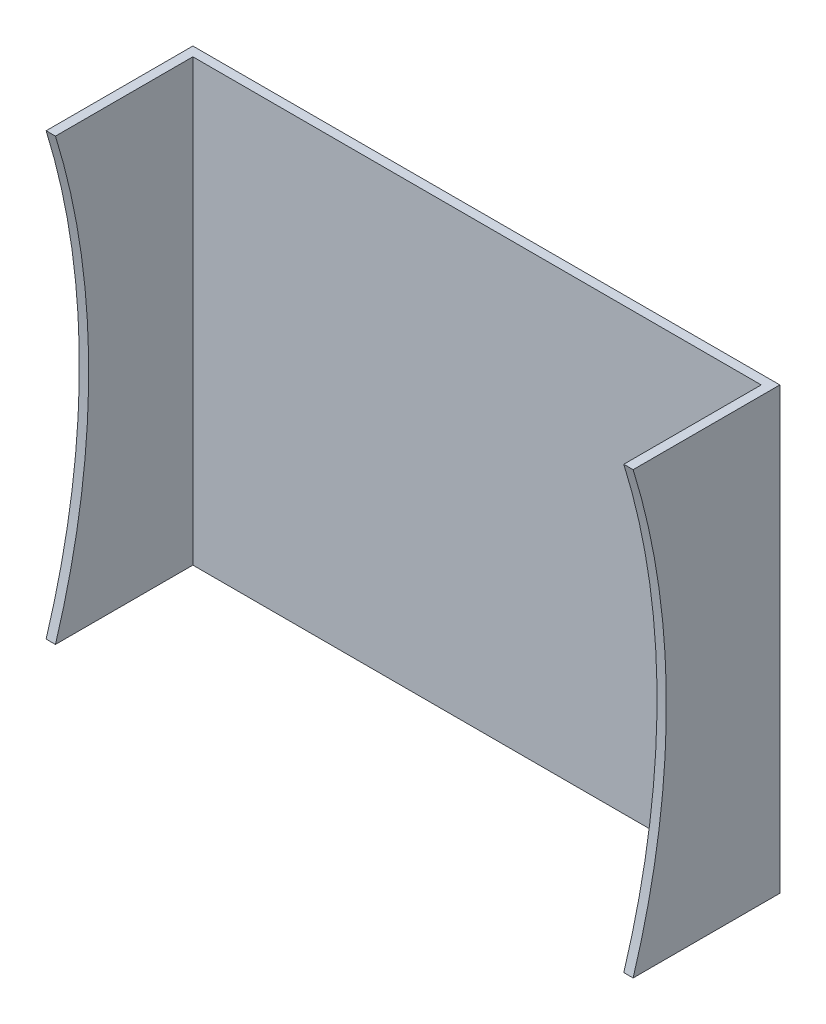
ISO-10303-21;
HEADER;
FILE_DESCRIPTION(('STEP AP214'),'2;1');
FILE_NAME('part.step','',(''),(''),'','','');
FILE_SCHEMA(('AUTOMOTIVE_DESIGN { 1 0 10303 214 1 1 1 1 }'));
ENDSEC;
DATA;
#1=APPLICATION_CONTEXT('core data for automotive mechanical design processes');
#2=APPLICATION_PROTOCOL_DEFINITION('international standard','automotive_design',2000,#1);
#3=PRODUCT_CONTEXT('',#1,'mechanical');
#4=PRODUCT('Part','Part','',(#3));
#5=PRODUCT_RELATED_PRODUCT_CATEGORY('part','',(#4));
#6=PRODUCT_DEFINITION_FORMATION('','',#4);
#7=PRODUCT_DEFINITION_CONTEXT('part definition',#1,'design');
#8=PRODUCT_DEFINITION('design','',#6,#7);
#9=PRODUCT_DEFINITION_SHAPE('','',#8);
#10=(LENGTH_UNIT() NAMED_UNIT(*) SI_UNIT(.MILLI.,.METRE.));
#11=(NAMED_UNIT(*) PLANE_ANGLE_UNIT() SI_UNIT($,.RADIAN.));
#12=(NAMED_UNIT(*) SI_UNIT($,.STERADIAN.) SOLID_ANGLE_UNIT());
#13=UNCERTAINTY_MEASURE_WITH_UNIT(LENGTH_MEASURE(1.E-05),#10,'distance_accuracy_value','');
#14=(GEOMETRIC_REPRESENTATION_CONTEXT(3) GLOBAL_UNCERTAINTY_ASSIGNED_CONTEXT((#13)) GLOBAL_UNIT_ASSIGNED_CONTEXT((#10,
#11,#12)) REPRESENTATION_CONTEXT('',''));
#15=CARTESIAN_POINT('',(0.,0.,0.));
#16=DIRECTION('',(0.,0.,1.));
#17=DIRECTION('',(1.,0.,0.));
#18=AXIS2_PLACEMENT_3D('',#15,#16,#17);
#19=CARTESIAN_POINT('',(3.18,0.,0.));
#20=DIRECTION('',(-1.,0.,0.));
#21=DIRECTION('',(0.,0.,1.));
#22=AXIS2_PLACEMENT_3D('',#19,#20,#21);
#23=CYLINDRICAL_SURFACE('',#22,254.);
#24=CARTESIAN_POINT('',(0.,0.,0.));
#25=DIRECTION('',(1.,0.,0.));
#26=DIRECTION('',(0.,0.,-1.));
#27=AXIS2_PLACEMENT_3D('',#24,#25,#26);
#28=CIRCLE('',#27,254.);
#29=CARTESIAN_POINT('',(0.,-75.,-242.674679354893));
#30=VERTEX_POINT('',#29);
#31=CARTESIAN_POINT('',(0.,75.,-242.674679354893));
#32=VERTEX_POINT('',#31);
#33=EDGE_CURVE('E82',#30,#32,#28,.T.);
#34=ORIENTED_EDGE('',*,*,#33,.F.);
#35=DIRECTION('',(-1.,0.,0.));
#36=VECTOR('',#35,1.);
#37=CARTESIAN_POINT('',(3.18,-75.,-242.674679354893));
#38=LINE('',#37,#36);
#39=CARTESIAN_POINT('',(3.18,-75.,-242.674679354893));
#40=VERTEX_POINT('',#39);
#41=EDGE_CURVE('E11',#40,#30,#38,.T.);
#42=ORIENTED_EDGE('',*,*,#41,.F.);
#43=CARTESIAN_POINT('',(3.18,0.,0.));
#44=DIRECTION('',(1.,0.,0.));
#45=DIRECTION('',(0.,0.,-1.));
#46=AXIS2_PLACEMENT_3D('',#43,#44,#45);
#47=CIRCLE('',#46,254.);
#48=CARTESIAN_POINT('',(3.18,75.,-242.674679354893));
#49=VERTEX_POINT('',#48);
#50=EDGE_CURVE('E79',#40,#49,#47,.T.);
#51=ORIENTED_EDGE('',*,*,#50,.T.);
#52=DIRECTION('',(-1.,0.,0.));
#53=VECTOR('',#52,1.);
#54=CARTESIAN_POINT('',(3.18,75.,-242.674679354893));
#55=LINE('',#54,#53);
#56=EDGE_CURVE('E47',#49,#32,#55,.T.);
#57=ORIENTED_EDGE('',*,*,#56,.T.);
#58=EDGE_LOOP('',(#34,#42,#51,#57));
#59=FACE_BOUND('',#58,.T.);
#60=ADVANCED_FACE('F39',(#59),#23,.F.);
#61=CARTESIAN_POINT('',(3.18,-75.,0.));
#62=DIRECTION('',(0.,-1.,0.));
#63=DIRECTION('',(0.,0.,-1.));
#64=AXIS2_PLACEMENT_3D('',#61,#62,#63);
#65=PLANE('',#64);
#66=DIRECTION('',(0.,0.,1.));
#67=VECTOR('',#66,1.);
#68=CARTESIAN_POINT('',(0.,-75.,0.));
#69=LINE('',#68,#67);
#70=CARTESIAN_POINT('',(0.,-75.,-292.674679354893));
#71=VERTEX_POINT('',#70);
#72=EDGE_CURVE('E100',#71,#30,#69,.T.);
#73=ORIENTED_EDGE('',*,*,#72,.F.);
#74=DIRECTION('',(-1.,0.,0.));
#75=VECTOR('',#74,1.);
#76=CARTESIAN_POINT('',(100.,-75.,-292.674679354893));
#77=LINE('',#76,#75);
#78=CARTESIAN_POINT('',(200.,-75.,-292.674679354893));
#79=VERTEX_POINT('',#78);
#80=EDGE_CURVE('E118',#79,#71,#77,.T.);
#81=ORIENTED_EDGE('',*,*,#80,.F.);
#82=DIRECTION('',(0.,0.,1.));
#83=VECTOR('',#82,1.);
#84=CARTESIAN_POINT('',(200.,-75.,0.));
#85=LINE('',#84,#83);
#86=CARTESIAN_POINT('',(200.,-75.,-242.674679354893));
#87=VERTEX_POINT('',#86);
#88=EDGE_CURVE('E138',#79,#87,#85,.T.);
#89=ORIENTED_EDGE('',*,*,#88,.T.);
#90=DIRECTION('',(1.,0.,0.));
#91=VECTOR('',#90,1.);
#92=CARTESIAN_POINT('',(196.82,-75.,-242.674679354893));
#93=LINE('',#92,#91);
#94=CARTESIAN_POINT('',(196.82,-75.,-242.674679354893));
#95=VERTEX_POINT('',#94);
#96=EDGE_CURVE('E125',#95,#87,#93,.T.);
#97=ORIENTED_EDGE('',*,*,#96,.F.);
#98=DIRECTION('',(0.,0.,1.));
#99=VECTOR('',#98,1.);
#100=CARTESIAN_POINT('',(196.82,-75.,0.));
#101=LINE('',#100,#99);
#102=CARTESIAN_POINT('',(196.82,-75.,-289.494679354893));
#103=VERTEX_POINT('',#102);
#104=EDGE_CURVE('E150',#103,#95,#101,.T.);
#105=ORIENTED_EDGE('',*,*,#104,.F.);
#106=DIRECTION('',(-1.,0.,0.));
#107=VECTOR('',#106,1.);
#108=CARTESIAN_POINT('',(100.,-75.,-289.494679354893));
#109=LINE('',#108,#107);
#110=CARTESIAN_POINT('',(3.18,-75.,-289.494679354893));
#111=VERTEX_POINT('',#110);
#112=EDGE_CURVE('E92',#103,#111,#109,.T.);
#113=ORIENTED_EDGE('',*,*,#112,.T.);
#114=DIRECTION('',(0.,0.,1.));
#115=VECTOR('',#114,1.);
#116=CARTESIAN_POINT('',(3.18,-75.,0.));
#117=LINE('',#116,#115);
#118=EDGE_CURVE('E72',#111,#40,#117,.T.);
#119=ORIENTED_EDGE('',*,*,#118,.T.);
#120=ORIENTED_EDGE('',*,*,#41,.T.);
#121=EDGE_LOOP('',(#73,#81,#89,#97,#105,#113,#119,#120));
#122=FACE_BOUND('',#121,.T.);
#123=ADVANCED_FACE('F89',(#122),#65,.T.);
#124=CARTESIAN_POINT('',(3.18,75.,0.));
#125=DIRECTION('',(0.,1.,0.));
#126=DIRECTION('',(0.,0.,1.));
#127=AXIS2_PLACEMENT_3D('',#124,#125,#126);
#128=PLANE('',#127);
#129=DIRECTION('',(0.,0.,-1.));
#130=VECTOR('',#129,1.);
#131=CARTESIAN_POINT('',(0.,75.,0.));
#132=LINE('',#131,#130);
#133=CARTESIAN_POINT('',(0.,75.,-292.674679354893));
#134=VERTEX_POINT('',#133);
#135=EDGE_CURVE('E86',#32,#134,#132,.T.);
#136=ORIENTED_EDGE('',*,*,#135,.F.);
#137=ORIENTED_EDGE('',*,*,#56,.F.);
#138=DIRECTION('',(0.,0.,-1.));
#139=VECTOR('',#138,1.);
#140=CARTESIAN_POINT('',(3.18,75.,0.));
#141=LINE('',#140,#139);
#142=CARTESIAN_POINT('',(3.18,75.,-289.494679354893));
#143=VERTEX_POINT('',#142);
#144=EDGE_CURVE('E85',#49,#143,#141,.T.);
#145=ORIENTED_EDGE('',*,*,#144,.T.);
#146=DIRECTION('',(-1.,0.,0.));
#147=VECTOR('',#146,1.);
#148=CARTESIAN_POINT('',(100.,75.,-289.494679354893));
#149=LINE('',#148,#147);
#150=CARTESIAN_POINT('',(196.82,75.,-289.494679354893));
#151=VERTEX_POINT('',#150);
#152=EDGE_CURVE('E119',#151,#143,#149,.T.);
#153=ORIENTED_EDGE('',*,*,#152,.F.);
#154=DIRECTION('',(0.,0.,-1.));
#155=VECTOR('',#154,1.);
#156=CARTESIAN_POINT('',(196.82,75.,0.));
#157=LINE('',#156,#155);
#158=CARTESIAN_POINT('',(196.82,75.,-242.674679354893));
#159=VERTEX_POINT('',#158);
#160=EDGE_CURVE('E135',#159,#151,#157,.T.);
#161=ORIENTED_EDGE('',*,*,#160,.F.);
#162=DIRECTION('',(1.,0.,0.));
#163=VECTOR('',#162,1.);
#164=CARTESIAN_POINT('',(196.82,75.,-242.674679354893));
#165=LINE('',#164,#163);
#166=CARTESIAN_POINT('',(200.,75.,-242.674679354893));
#167=VERTEX_POINT('',#166);
#168=EDGE_CURVE('E130',#159,#167,#165,.T.);
#169=ORIENTED_EDGE('',*,*,#168,.T.);
#170=DIRECTION('',(0.,0.,-1.));
#171=VECTOR('',#170,1.);
#172=CARTESIAN_POINT('',(200.,75.,0.));
#173=LINE('',#172,#171);
#174=CARTESIAN_POINT('',(200.,75.,-292.674679354893));
#175=VERTEX_POINT('',#174);
#176=EDGE_CURVE('E114',#167,#175,#173,.T.);
#177=ORIENTED_EDGE('',*,*,#176,.T.);
#178=DIRECTION('',(-1.,0.,0.));
#179=VECTOR('',#178,1.);
#180=CARTESIAN_POINT('',(100.,75.,-292.674679354893));
#181=LINE('',#180,#179);
#182=EDGE_CURVE('E109',#175,#134,#181,.T.);
#183=ORIENTED_EDGE('',*,*,#182,.T.);
#184=EDGE_LOOP('',(#136,#137,#145,#153,#161,#169,#177,#183));
#185=FACE_BOUND('',#184,.T.);
#186=ADVANCED_FACE('F106',(#185),#128,.T.);
#187=CARTESIAN_POINT('',(3.18,0.,0.));
#188=DIRECTION('',(1.,0.,0.));
#189=DIRECTION('',(0.,0.,-1.));
#190=AXIS2_PLACEMENT_3D('',#187,#188,#189);
#191=PLANE('',#190);
#192=ORIENTED_EDGE('',*,*,#50,.F.);
#193=ORIENTED_EDGE('',*,*,#118,.F.);
#194=DIRECTION('',(0.,-1.,0.));
#195=VECTOR('',#194,1.);
#196=CARTESIAN_POINT('',(3.18,0.,-289.494679354893));
#197=LINE('',#196,#195);
#198=EDGE_CURVE('E93',#143,#111,#197,.T.);
#199=ORIENTED_EDGE('',*,*,#198,.F.);
#200=ORIENTED_EDGE('',*,*,#144,.F.);
#201=EDGE_LOOP('',(#192,#193,#199,#200));
#202=FACE_BOUND('',#201,.T.);
#203=ADVANCED_FACE('F84',(#202),#191,.T.);
#204=CARTESIAN_POINT('',(0.,0.,0.));
#205=DIRECTION('',(1.,0.,0.));
#206=DIRECTION('',(0.,0.,-1.));
#207=AXIS2_PLACEMENT_3D('',#204,#205,#206);
#208=PLANE('',#207);
#209=ORIENTED_EDGE('',*,*,#33,.T.);
#210=ORIENTED_EDGE('',*,*,#135,.T.);
#211=DIRECTION('',(0.,-1.,0.));
#212=VECTOR('',#211,1.);
#213=CARTESIAN_POINT('',(0.,0.,-292.674679354893));
#214=LINE('',#213,#212);
#215=EDGE_CURVE('E122',#134,#71,#214,.T.);
#216=ORIENTED_EDGE('',*,*,#215,.T.);
#217=ORIENTED_EDGE('',*,*,#72,.T.);
#218=EDGE_LOOP('',(#209,#210,#216,#217));
#219=FACE_BOUND('',#218,.T.);
#220=ADVANCED_FACE('F103',(#219),#208,.F.);
#221=CARTESIAN_POINT('',(100.,0.,-289.494679354893));
#222=DIRECTION('',(0.,0.,-1.));
#223=DIRECTION('',(-1.,0.,0.));
#224=AXIS2_PLACEMENT_3D('',#221,#222,#223);
#225=PLANE('',#224);
#226=ORIENTED_EDGE('',*,*,#152,.T.);
#227=ORIENTED_EDGE('',*,*,#198,.T.);
#228=ORIENTED_EDGE('',*,*,#112,.F.);
#229=DIRECTION('',(0.,-1.,0.));
#230=VECTOR('',#229,1.);
#231=CARTESIAN_POINT('',(196.82,0.,-289.494679354893));
#232=LINE('',#231,#230);
#233=EDGE_CURVE('E147',#151,#103,#232,.T.);
#234=ORIENTED_EDGE('',*,*,#233,.F.);
#235=EDGE_LOOP('',(#226,#227,#228,#234));
#236=FACE_BOUND('',#235,.T.);
#237=ADVANCED_FACE('F185',(#236),#225,.F.);
#238=CARTESIAN_POINT('',(100.,0.,-292.674679354893));
#239=DIRECTION('',(0.,0.,-1.));
#240=DIRECTION('',(-1.,0.,0.));
#241=AXIS2_PLACEMENT_3D('',#238,#239,#240);
#242=PLANE('',#241);
#243=ORIENTED_EDGE('',*,*,#215,.F.);
#244=ORIENTED_EDGE('',*,*,#182,.F.);
#245=DIRECTION('',(0.,-1.,0.));
#246=VECTOR('',#245,1.);
#247=CARTESIAN_POINT('',(200.,0.,-292.674679354893));
#248=LINE('',#247,#246);
#249=EDGE_CURVE('E144',#175,#79,#248,.T.);
#250=ORIENTED_EDGE('',*,*,#249,.T.);
#251=ORIENTED_EDGE('',*,*,#80,.T.);
#252=EDGE_LOOP('',(#243,#244,#250,#251));
#253=FACE_BOUND('',#252,.T.);
#254=ADVANCED_FACE('F123',(#253),#242,.T.);
#255=CARTESIAN_POINT('',(196.82,0.,0.));
#256=DIRECTION('',(1.,0.,0.));
#257=DIRECTION('',(0.,0.,1.));
#258=AXIS2_PLACEMENT_3D('',#255,#256,#257);
#259=CYLINDRICAL_SURFACE('',#258,254.);
#260=CARTESIAN_POINT('',(200.,0.,0.));
#261=DIRECTION('',(1.,0.,0.));
#262=DIRECTION('',(0.,0.,-1.));
#263=AXIS2_PLACEMENT_3D('',#260,#261,#262);
#264=CIRCLE('',#263,254.);
#265=EDGE_CURVE('E141',#87,#167,#264,.T.);
#266=ORIENTED_EDGE('',*,*,#265,.T.);
#267=ORIENTED_EDGE('',*,*,#168,.F.);
#268=CARTESIAN_POINT('',(196.82,0.,0.));
#269=DIRECTION('',(1.,0.,0.));
#270=DIRECTION('',(0.,0.,-1.));
#271=AXIS2_PLACEMENT_3D('',#268,#269,#270);
#272=CIRCLE('',#271,254.);
#273=EDGE_CURVE('E137',#95,#159,#272,.T.);
#274=ORIENTED_EDGE('',*,*,#273,.F.);
#275=ORIENTED_EDGE('',*,*,#96,.T.);
#276=EDGE_LOOP('',(#266,#267,#274,#275));
#277=FACE_BOUND('',#276,.T.);
#278=ADVANCED_FACE('F169',(#277),#259,.F.);
#279=CARTESIAN_POINT('',(196.82,0.,0.));
#280=DIRECTION('',(-1.,0.,0.));
#281=DIRECTION('',(0.,0.,-1.));
#282=AXIS2_PLACEMENT_3D('',#279,#280,#281);
#283=PLANE('',#282);
#284=ORIENTED_EDGE('',*,*,#273,.T.);
#285=ORIENTED_EDGE('',*,*,#160,.T.);
#286=ORIENTED_EDGE('',*,*,#233,.T.);
#287=ORIENTED_EDGE('',*,*,#104,.T.);
#288=EDGE_LOOP('',(#284,#285,#286,#287));
#289=FACE_BOUND('',#288,.T.);
#290=ADVANCED_FACE('F175',(#289),#283,.T.);
#291=CARTESIAN_POINT('',(200.,0.,0.));
#292=DIRECTION('',(-1.,0.,0.));
#293=DIRECTION('',(0.,0.,-1.));
#294=AXIS2_PLACEMENT_3D('',#291,#292,#293);
#295=PLANE('',#294);
#296=ORIENTED_EDGE('',*,*,#265,.F.);
#297=ORIENTED_EDGE('',*,*,#88,.F.);
#298=ORIENTED_EDGE('',*,*,#249,.F.);
#299=ORIENTED_EDGE('',*,*,#176,.F.);
#300=EDGE_LOOP('',(#296,#297,#298,#299));
#301=FACE_BOUND('',#300,.T.);
#302=ADVANCED_FACE('F160',(#301),#295,.F.);
#303=CLOSED_SHELL('',(#60,#123,#186,#203,#220,#237,#254,#278,#290,#302));
#304=MANIFOLD_SOLID_BREP('B2',#303);
#305=ADVANCED_BREP_SHAPE_REPRESENTATION('',(#18,#304),#14);
#306=SHAPE_DEFINITION_REPRESENTATION(#9,#305);
ENDSEC;
END-ISO-10303-21;
